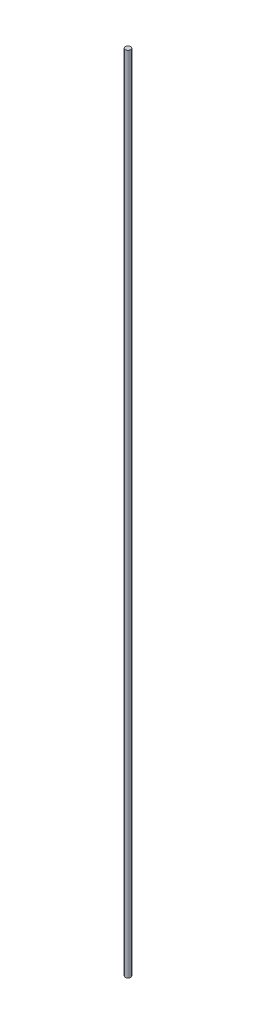
ISO-10303-21;
HEADER;
FILE_DESCRIPTION(('STEP AP214'),'2;1');
FILE_NAME('part.step','',(''),(''),'','','');
FILE_SCHEMA(('AUTOMOTIVE_DESIGN { 1 0 10303 214 1 1 1 1 }'));
ENDSEC;
DATA;
#1=APPLICATION_CONTEXT('core data for automotive mechanical design processes');
#2=APPLICATION_PROTOCOL_DEFINITION('international standard','automotive_design',2000,#1);
#3=PRODUCT_CONTEXT('',#1,'mechanical');
#4=PRODUCT('Part','Part','',(#3));
#5=PRODUCT_RELATED_PRODUCT_CATEGORY('part','',(#4));
#6=PRODUCT_DEFINITION_FORMATION('','',#4);
#7=PRODUCT_DEFINITION_CONTEXT('part definition',#1,'design');
#8=PRODUCT_DEFINITION('design','',#6,#7);
#9=PRODUCT_DEFINITION_SHAPE('','',#8);
#10=(LENGTH_UNIT() NAMED_UNIT(*) SI_UNIT(.MILLI.,.METRE.));
#11=(NAMED_UNIT(*) PLANE_ANGLE_UNIT() SI_UNIT($,.RADIAN.));
#12=(NAMED_UNIT(*) SI_UNIT($,.STERADIAN.) SOLID_ANGLE_UNIT());
#13=UNCERTAINTY_MEASURE_WITH_UNIT(LENGTH_MEASURE(1.E-05),#10,'distance_accuracy_value','');
#14=(GEOMETRIC_REPRESENTATION_CONTEXT(3) GLOBAL_UNCERTAINTY_ASSIGNED_CONTEXT((#13)) GLOBAL_UNIT_ASSIGNED_CONTEXT((#10,
#11,#12)) REPRESENTATION_CONTEXT('',''));
#15=CARTESIAN_POINT('',(0.,0.,0.));
#16=DIRECTION('',(0.,0.,1.));
#17=DIRECTION('',(1.,0.,0.));
#18=AXIS2_PLACEMENT_3D('',#15,#16,#17);
#19=CARTESIAN_POINT('',(0.,900.,0.));
#20=DIRECTION('',(0.,-1.,0.));
#21=DIRECTION('',(0.,0.,-1.));
#22=AXIS2_PLACEMENT_3D('',#19,#20,#21);
#23=CYLINDRICAL_SURFACE('',#22,3.);
#24=CARTESIAN_POINT('',(0.,900.,0.));
#25=DIRECTION('',(0.,1.,0.));
#26=DIRECTION('',(0.,0.,1.));
#27=AXIS2_PLACEMENT_3D('',#24,#25,#26);
#28=CIRCLE('',#27,3.);
#29=CARTESIAN_POINT('',(0.,900.,3.));
#30=VERTEX_POINT('',#29);
#31=EDGE_CURVE('E10',#30,#30,#28,.T.);
#32=ORIENTED_EDGE('',*,*,#31,.F.);
#33=EDGE_LOOP('',(#32));
#34=FACE_BOUND('',#33,.T.);
#35=CARTESIAN_POINT('',(0.,0.,0.));
#36=DIRECTION('',(0.,1.,0.));
#37=DIRECTION('',(0.,0.,1.));
#38=AXIS2_PLACEMENT_3D('',#35,#36,#37);
#39=CIRCLE('',#38,3.);
#40=CARTESIAN_POINT('',(0.,0.,3.));
#41=VERTEX_POINT('',#40);
#42=EDGE_CURVE('E34',#41,#41,#39,.T.);
#43=ORIENTED_EDGE('',*,*,#42,.T.);
#44=EDGE_LOOP('',(#43));
#45=FACE_BOUND('',#44,.T.);
#46=ADVANCED_FACE('F31',(#34,#45),#23,.T.);
#47=CARTESIAN_POINT('',(0.,900.,0.));
#48=DIRECTION('',(0.,1.,0.));
#49=DIRECTION('',(0.,0.,1.));
#50=AXIS2_PLACEMENT_3D('',#47,#48,#49);
#51=PLANE('',#50);
#52=ORIENTED_EDGE('',*,*,#31,.T.);
#53=EDGE_LOOP('',(#52));
#54=FACE_BOUND('',#53,.T.);
#55=ADVANCED_FACE('F46',(#54),#51,.T.);
#56=CARTESIAN_POINT('',(0.,0.,0.));
#57=DIRECTION('',(0.,1.,0.));
#58=DIRECTION('',(0.,0.,1.));
#59=AXIS2_PLACEMENT_3D('',#56,#57,#58);
#60=PLANE('',#59);
#61=ORIENTED_EDGE('',*,*,#42,.F.);
#62=EDGE_LOOP('',(#61));
#63=FACE_BOUND('',#62,.T.);
#64=ADVANCED_FACE('F44',(#63),#60,.F.);
#65=CLOSED_SHELL('',(#46,#55,#64));
#66=MANIFOLD_SOLID_BREP('B2',#65);
#67=ADVANCED_BREP_SHAPE_REPRESENTATION('',(#18,#66),#14);
#68=SHAPE_DEFINITION_REPRESENTATION(#9,#67);
ENDSEC;
END-ISO-10303-21;
